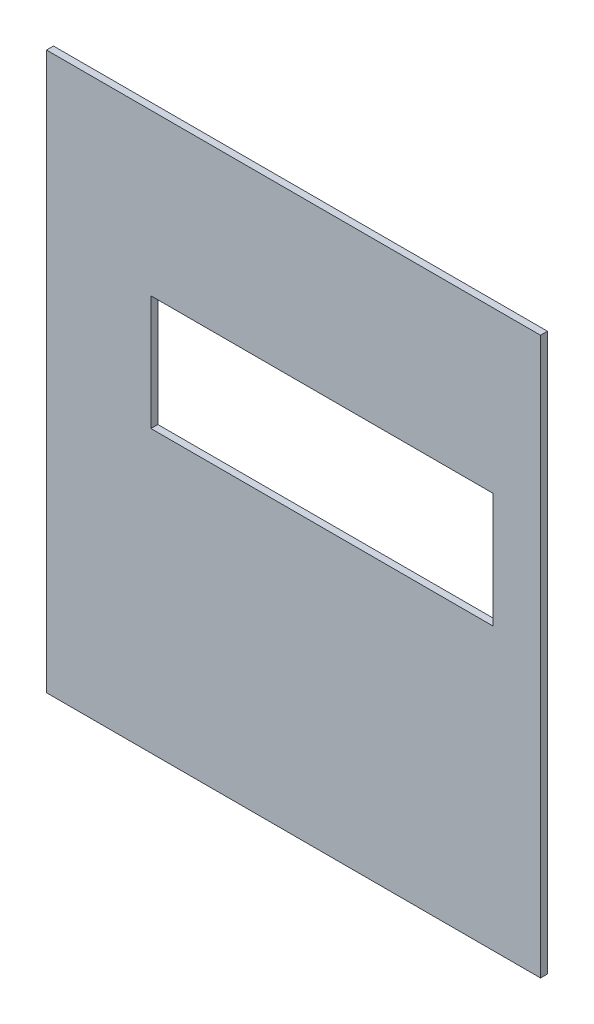
ISO-10303-21;
HEADER;
FILE_DESCRIPTION(('STEP AP214'),'2;1');
FILE_NAME('part.step','',(''),(''),'','','');
FILE_SCHEMA(('AUTOMOTIVE_DESIGN { 1 0 10303 214 1 1 1 1 }'));
ENDSEC;
DATA;
#1=APPLICATION_CONTEXT('core data for automotive mechanical design processes');
#2=APPLICATION_PROTOCOL_DEFINITION('international standard','automotive_design',2000,#1);
#3=PRODUCT_CONTEXT('',#1,'mechanical');
#4=PRODUCT('Part','Part','',(#3));
#5=PRODUCT_RELATED_PRODUCT_CATEGORY('part','',(#4));
#6=PRODUCT_DEFINITION_FORMATION('','',#4);
#7=PRODUCT_DEFINITION_CONTEXT('part definition',#1,'design');
#8=PRODUCT_DEFINITION('design','',#6,#7);
#9=PRODUCT_DEFINITION_SHAPE('','',#8);
#10=(LENGTH_UNIT() NAMED_UNIT(*) SI_UNIT(.MILLI.,.METRE.));
#11=(NAMED_UNIT(*) PLANE_ANGLE_UNIT() SI_UNIT($,.RADIAN.));
#12=(NAMED_UNIT(*) SI_UNIT($,.STERADIAN.) SOLID_ANGLE_UNIT());
#13=UNCERTAINTY_MEASURE_WITH_UNIT(LENGTH_MEASURE(1.E-05),#10,'distance_accuracy_value','');
#14=(GEOMETRIC_REPRESENTATION_CONTEXT(3) GLOBAL_UNCERTAINTY_ASSIGNED_CONTEXT((#13)) GLOBAL_UNIT_ASSIGNED_CONTEXT((#10,
#11,#12)) REPRESENTATION_CONTEXT('',''));
#15=CARTESIAN_POINT('',(0.,0.,0.));
#16=DIRECTION('',(0.,0.,1.));
#17=DIRECTION('',(1.,0.,0.));
#18=AXIS2_PLACEMENT_3D('',#15,#16,#17);
#19=CARTESIAN_POINT('',(177.5,200.,5.));
#20=DIRECTION('',(-1.,0.,0.));
#21=DIRECTION('',(0.,-1.,0.));
#22=AXIS2_PLACEMENT_3D('',#19,#20,#21);
#23=PLANE('',#22);
#24=DIRECTION('',(0.,1.,0.));
#25=VECTOR('',#24,1.);
#26=CARTESIAN_POINT('',(177.5,200.,0.));
#27=LINE('',#26,#25);
#28=CARTESIAN_POINT('',(177.5,-200.,0.));
#29=VERTEX_POINT('',#28);
#30=CARTESIAN_POINT('',(177.5,200.,0.));
#31=VERTEX_POINT('',#30);
#32=EDGE_CURVE('E135',#29,#31,#27,.T.);
#33=ORIENTED_EDGE('',*,*,#32,.T.);
#34=DIRECTION('',(0.,0.,-1.));
#35=VECTOR('',#34,1.);
#36=CARTESIAN_POINT('',(177.5,200.,5.));
#37=LINE('',#36,#35);
#38=CARTESIAN_POINT('',(177.5,200.,5.));
#39=VERTEX_POINT('',#38);
#40=EDGE_CURVE('E11',#39,#31,#37,.T.);
#41=ORIENTED_EDGE('',*,*,#40,.F.);
#42=DIRECTION('',(0.,1.,0.));
#43=VECTOR('',#42,1.);
#44=CARTESIAN_POINT('',(177.5,200.,5.));
#45=LINE('',#44,#43);
#46=CARTESIAN_POINT('',(177.5,-200.,5.));
#47=VERTEX_POINT('',#46);
#48=EDGE_CURVE('E139',#47,#39,#45,.T.);
#49=ORIENTED_EDGE('',*,*,#48,.F.);
#50=DIRECTION('',(0.,0.,-1.));
#51=VECTOR('',#50,1.);
#52=CARTESIAN_POINT('',(177.5,-200.,5.));
#53=LINE('',#52,#51);
#54=EDGE_CURVE('E149',#47,#29,#53,.T.);
#55=ORIENTED_EDGE('',*,*,#54,.T.);
#56=EDGE_LOOP('',(#33,#41,#49,#55));
#57=FACE_BOUND('',#56,.T.);
#58=ADVANCED_FACE('F38',(#57),#23,.F.);
#59=CARTESIAN_POINT('',(-177.5,200.,5.));
#60=DIRECTION('',(0.,-1.,0.));
#61=DIRECTION('',(0.,0.,-1.));
#62=AXIS2_PLACEMENT_3D('',#59,#60,#61);
#63=PLANE('',#62);
#64=DIRECTION('',(-1.,0.,0.));
#65=VECTOR('',#64,1.);
#66=CARTESIAN_POINT('',(-177.5,200.,0.));
#67=LINE('',#66,#65);
#68=CARTESIAN_POINT('',(-177.5,200.,0.));
#69=VERTEX_POINT('',#68);
#70=EDGE_CURVE('E152',#31,#69,#67,.T.);
#71=ORIENTED_EDGE('',*,*,#70,.T.);
#72=DIRECTION('',(0.,0.,-1.));
#73=VECTOR('',#72,1.);
#74=CARTESIAN_POINT('',(-177.5,200.,5.));
#75=LINE('',#74,#73);
#76=CARTESIAN_POINT('',(-177.5,200.,5.));
#77=VERTEX_POINT('',#76);
#78=EDGE_CURVE('E45',#77,#69,#75,.T.);
#79=ORIENTED_EDGE('',*,*,#78,.F.);
#80=DIRECTION('',(-1.,0.,0.));
#81=VECTOR('',#80,1.);
#82=CARTESIAN_POINT('',(-177.5,200.,5.));
#83=LINE('',#82,#81);
#84=EDGE_CURVE('E142',#39,#77,#83,.T.);
#85=ORIENTED_EDGE('',*,*,#84,.F.);
#86=ORIENTED_EDGE('',*,*,#40,.T.);
#87=EDGE_LOOP('',(#71,#79,#85,#86));
#88=FACE_BOUND('',#87,.T.);
#89=ADVANCED_FACE('F180',(#88),#63,.F.);
#90=CARTESIAN_POINT('',(-177.5,200.,5.));
#91=DIRECTION('',(1.,0.,0.));
#92=DIRECTION('',(0.,1.,0.));
#93=AXIS2_PLACEMENT_3D('',#90,#91,#92);
#94=PLANE('',#93);
#95=DIRECTION('',(0.,-1.,0.));
#96=VECTOR('',#95,1.);
#97=CARTESIAN_POINT('',(-177.5,200.,0.));
#98=LINE('',#97,#96);
#99=CARTESIAN_POINT('',(-177.5,-200.,0.));
#100=VERTEX_POINT('',#99);
#101=EDGE_CURVE('E154',#69,#100,#98,.T.);
#102=ORIENTED_EDGE('',*,*,#101,.T.);
#103=DIRECTION('',(0.,0.,-1.));
#104=VECTOR('',#103,1.);
#105=CARTESIAN_POINT('',(-177.5,-200.,5.));
#106=LINE('',#105,#104);
#107=CARTESIAN_POINT('',(-177.5,-200.,5.));
#108=VERTEX_POINT('',#107);
#109=EDGE_CURVE('E159',#108,#100,#106,.T.);
#110=ORIENTED_EDGE('',*,*,#109,.F.);
#111=DIRECTION('',(0.,-1.,0.));
#112=VECTOR('',#111,1.);
#113=CARTESIAN_POINT('',(-177.5,200.,5.));
#114=LINE('',#113,#112);
#115=EDGE_CURVE('E145',#77,#108,#114,.T.);
#116=ORIENTED_EDGE('',*,*,#115,.F.);
#117=ORIENTED_EDGE('',*,*,#78,.T.);
#118=EDGE_LOOP('',(#102,#110,#116,#117));
#119=FACE_BOUND('',#118,.T.);
#120=ADVANCED_FACE('F166',(#119),#94,.F.);
#121=CARTESIAN_POINT('',(-177.5,-200.,5.));
#122=DIRECTION('',(0.,1.,0.));
#123=DIRECTION('',(0.,0.,1.));
#124=AXIS2_PLACEMENT_3D('',#121,#122,#123);
#125=PLANE('',#124);
#126=DIRECTION('',(1.,0.,0.));
#127=VECTOR('',#126,1.);
#128=CARTESIAN_POINT('',(-177.5,-200.,0.));
#129=LINE('',#128,#127);
#130=EDGE_CURVE('E143',#100,#29,#129,.T.);
#131=ORIENTED_EDGE('',*,*,#130,.T.);
#132=ORIENTED_EDGE('',*,*,#54,.F.);
#133=DIRECTION('',(1.,0.,0.));
#134=VECTOR('',#133,1.);
#135=CARTESIAN_POINT('',(-177.5,-200.,5.));
#136=LINE('',#135,#134);
#137=EDGE_CURVE('E147',#108,#47,#136,.T.);
#138=ORIENTED_EDGE('',*,*,#137,.F.);
#139=ORIENTED_EDGE('',*,*,#109,.T.);
#140=EDGE_LOOP('',(#131,#132,#138,#139));
#141=FACE_BOUND('',#140,.T.);
#142=ADVANCED_FACE('F173',(#141),#125,.F.);
#143=CARTESIAN_POINT('',(0.,0.,5.));
#144=DIRECTION('',(0.,0.,1.));
#145=DIRECTION('',(1.,0.,0.));
#146=AXIS2_PLACEMENT_3D('',#143,#144,#145);
#147=PLANE('',#146);
#148=DIRECTION('',(0.,1.,0.));
#149=VECTOR('',#148,1.);
#150=CARTESIAN_POINT('',(143.500000000009,84.563807893328,5.));
#151=LINE('',#150,#149);
#152=CARTESIAN_POINT('',(143.500000000009,1.96201007872254,5.));
#153=VERTEX_POINT('',#152);
#154=CARTESIAN_POINT('',(143.500000000009,84.563807893328,5.));
#155=VERTEX_POINT('',#154);
#156=EDGE_CURVE('E52',#153,#155,#151,.T.);
#157=ORIENTED_EDGE('',*,*,#156,.F.);
#158=DIRECTION('',(1.,0.,0.));
#159=VECTOR('',#158,1.);
#160=CARTESIAN_POINT('',(143.500000000009,1.96201007872254,5.));
#161=LINE('',#160,#159);
#162=CARTESIAN_POINT('',(-102.499999999991,1.96201007872254,5.));
#163=VERTEX_POINT('',#162);
#164=EDGE_CURVE('E120',#163,#153,#161,.T.);
#165=ORIENTED_EDGE('',*,*,#164,.F.);
#166=DIRECTION('',(0.,-1.,0.));
#167=VECTOR('',#166,1.);
#168=CARTESIAN_POINT('',(-102.499999999991,84.563807893328,5.));
#169=LINE('',#168,#167);
#170=CARTESIAN_POINT('',(-102.499999999991,84.563807893328,5.));
#171=VERTEX_POINT('',#170);
#172=EDGE_CURVE('E123',#171,#163,#169,.T.);
#173=ORIENTED_EDGE('',*,*,#172,.F.);
#174=DIRECTION('',(-1.,0.,0.));
#175=VECTOR('',#174,1.);
#176=CARTESIAN_POINT('',(143.500000000009,84.563807893328,5.));
#177=LINE('',#176,#175);
#178=EDGE_CURVE('E129',#155,#171,#177,.T.);
#179=ORIENTED_EDGE('',*,*,#178,.F.);
#180=EDGE_LOOP('',(#157,#165,#173,#179));
#181=FACE_BOUND('',#180,.T.);
#182=ORIENTED_EDGE('',*,*,#48,.T.);
#183=ORIENTED_EDGE('',*,*,#84,.T.);
#184=ORIENTED_EDGE('',*,*,#115,.T.);
#185=ORIENTED_EDGE('',*,*,#137,.T.);
#186=EDGE_LOOP('',(#182,#183,#184,#185));
#187=FACE_BOUND('',#186,.T.);
#188=ADVANCED_FACE('F179',(#181,#187),#147,.T.);
#189=CARTESIAN_POINT('',(0.,0.,0.));
#190=DIRECTION('',(0.,0.,1.));
#191=DIRECTION('',(1.,0.,0.));
#192=AXIS2_PLACEMENT_3D('',#189,#190,#191);
#193=PLANE('',#192);
#194=DIRECTION('',(1.,0.,0.));
#195=VECTOR('',#194,1.);
#196=CARTESIAN_POINT('',(143.500000000009,1.96201007872254,0.));
#197=LINE('',#196,#195);
#198=CARTESIAN_POINT('',(-102.499999999991,1.96201007872254,0.));
#199=VERTEX_POINT('',#198);
#200=CARTESIAN_POINT('',(143.500000000009,1.96201007872254,0.));
#201=VERTEX_POINT('',#200);
#202=EDGE_CURVE('E110',#199,#201,#197,.T.);
#203=ORIENTED_EDGE('',*,*,#202,.T.);
#204=DIRECTION('',(0.,1.,0.));
#205=VECTOR('',#204,1.);
#206=CARTESIAN_POINT('',(143.500000000009,84.563807893328,0.));
#207=LINE('',#206,#205);
#208=CARTESIAN_POINT('',(143.500000000009,84.563807893328,0.));
#209=VERTEX_POINT('',#208);
#210=EDGE_CURVE('E104',#201,#209,#207,.T.);
#211=ORIENTED_EDGE('',*,*,#210,.T.);
#212=DIRECTION('',(-1.,0.,0.));
#213=VECTOR('',#212,1.);
#214=CARTESIAN_POINT('',(143.500000000009,84.563807893328,0.));
#215=LINE('',#214,#213);
#216=CARTESIAN_POINT('',(-102.499999999991,84.563807893328,0.));
#217=VERTEX_POINT('',#216);
#218=EDGE_CURVE('E113',#209,#217,#215,.T.);
#219=ORIENTED_EDGE('',*,*,#218,.T.);
#220=DIRECTION('',(0.,-1.,0.));
#221=VECTOR('',#220,1.);
#222=CARTESIAN_POINT('',(-102.499999999991,84.563807893328,0.));
#223=LINE('',#222,#221);
#224=EDGE_CURVE('E60',#217,#199,#223,.T.);
#225=ORIENTED_EDGE('',*,*,#224,.T.);
#226=EDGE_LOOP('',(#203,#211,#219,#225));
#227=FACE_BOUND('',#226,.T.);
#228=ORIENTED_EDGE('',*,*,#32,.F.);
#229=ORIENTED_EDGE('',*,*,#130,.F.);
#230=ORIENTED_EDGE('',*,*,#101,.F.);
#231=ORIENTED_EDGE('',*,*,#70,.F.);
#232=EDGE_LOOP('',(#228,#229,#230,#231));
#233=FACE_BOUND('',#232,.T.);
#234=ADVANCED_FACE('F117',(#227,#233),#193,.F.);
#235=CARTESIAN_POINT('',(143.500000000009,84.563807893328,0.));
#236=DIRECTION('',(1.,0.,0.));
#237=DIRECTION('',(0.,0.,-1.));
#238=AXIS2_PLACEMENT_3D('',#235,#236,#237);
#239=PLANE('',#238);
#240=ORIENTED_EDGE('',*,*,#156,.T.);
#241=DIRECTION('',(0.,0.,1.));
#242=VECTOR('',#241,1.);
#243=CARTESIAN_POINT('',(143.500000000009,84.563807893328,0.));
#244=LINE('',#243,#242);
#245=EDGE_CURVE('E100',#209,#155,#244,.T.);
#246=ORIENTED_EDGE('',*,*,#245,.F.);
#247=ORIENTED_EDGE('',*,*,#210,.F.);
#248=DIRECTION('',(0.,0.,1.));
#249=VECTOR('',#248,1.);
#250=CARTESIAN_POINT('',(143.500000000009,1.96201007872254,0.));
#251=LINE('',#250,#249);
#252=EDGE_CURVE('E133',#201,#153,#251,.T.);
#253=ORIENTED_EDGE('',*,*,#252,.T.);
#254=EDGE_LOOP('',(#240,#246,#247,#253));
#255=FACE_BOUND('',#254,.T.);
#256=ADVANCED_FACE('F102',(#255),#239,.F.);
#257=CARTESIAN_POINT('',(143.500000000009,1.96201007872254,0.));
#258=DIRECTION('',(0.,-1.,0.));
#259=DIRECTION('',(0.,0.,-1.));
#260=AXIS2_PLACEMENT_3D('',#257,#258,#259);
#261=PLANE('',#260);
#262=ORIENTED_EDGE('',*,*,#164,.T.);
#263=ORIENTED_EDGE('',*,*,#252,.F.);
#264=ORIENTED_EDGE('',*,*,#202,.F.);
#265=DIRECTION('',(0.,0.,1.));
#266=VECTOR('',#265,1.);
#267=CARTESIAN_POINT('',(-102.499999999991,1.96201007872254,0.));
#268=LINE('',#267,#266);
#269=EDGE_CURVE('E136',#199,#163,#268,.T.);
#270=ORIENTED_EDGE('',*,*,#269,.T.);
#271=EDGE_LOOP('',(#262,#263,#264,#270));
#272=FACE_BOUND('',#271,.T.);
#273=ADVANCED_FACE('F197',(#272),#261,.F.);
#274=CARTESIAN_POINT('',(-102.499999999991,84.563807893328,0.));
#275=DIRECTION('',(-1.,0.,0.));
#276=DIRECTION('',(0.,0.,1.));
#277=AXIS2_PLACEMENT_3D('',#274,#275,#276);
#278=PLANE('',#277);
#279=ORIENTED_EDGE('',*,*,#172,.T.);
#280=ORIENTED_EDGE('',*,*,#269,.F.);
#281=ORIENTED_EDGE('',*,*,#224,.F.);
#282=DIRECTION('',(0.,0.,1.));
#283=VECTOR('',#282,1.);
#284=CARTESIAN_POINT('',(-102.499999999991,84.563807893328,0.));
#285=LINE('',#284,#283);
#286=EDGE_CURVE('E109',#217,#171,#285,.T.);
#287=ORIENTED_EDGE('',*,*,#286,.T.);
#288=EDGE_LOOP('',(#279,#280,#281,#287));
#289=FACE_BOUND('',#288,.T.);
#290=ADVANCED_FACE('F200',(#289),#278,.F.);
#291=CARTESIAN_POINT('',(143.500000000009,84.563807893328,0.));
#292=DIRECTION('',(0.,1.,0.));
#293=DIRECTION('',(0.,0.,1.));
#294=AXIS2_PLACEMENT_3D('',#291,#292,#293);
#295=PLANE('',#294);
#296=ORIENTED_EDGE('',*,*,#178,.T.);
#297=ORIENTED_EDGE('',*,*,#286,.F.);
#298=ORIENTED_EDGE('',*,*,#218,.F.);
#299=ORIENTED_EDGE('',*,*,#245,.T.);
#300=EDGE_LOOP('',(#296,#297,#298,#299));
#301=FACE_BOUND('',#300,.T.);
#302=ADVANCED_FACE('F114',(#301),#295,.F.);
#303=CLOSED_SHELL('',(#58,#89,#120,#142,#188,#234,#256,#273,#290,#302));
#304=MANIFOLD_SOLID_BREP('B2',#303);
#305=ADVANCED_BREP_SHAPE_REPRESENTATION('',(#18,#304),#14);
#306=SHAPE_DEFINITION_REPRESENTATION(#9,#305);
ENDSEC;
END-ISO-10303-21;
